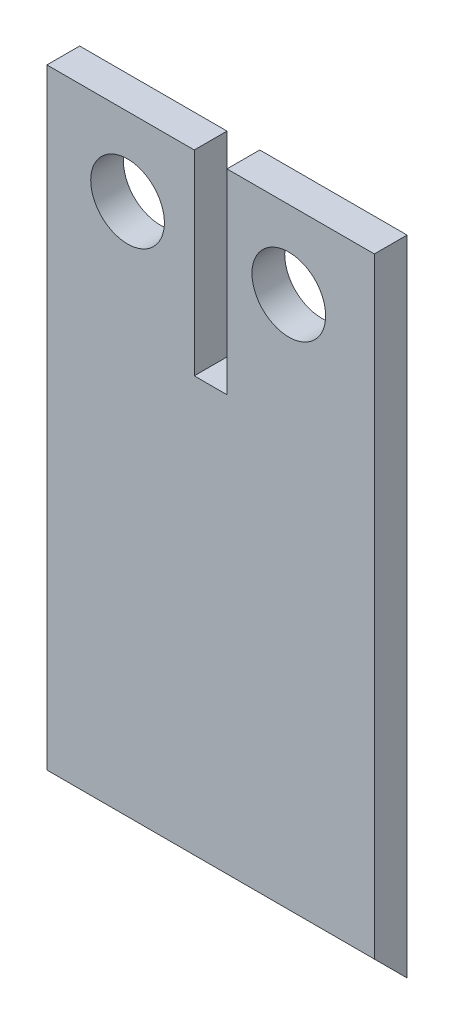
ISO-10303-21;
HEADER;
FILE_DESCRIPTION(('STEP AP214'),'2;1');
FILE_NAME('part.step','',(''),(''),'','','');
FILE_SCHEMA(('AUTOMOTIVE_DESIGN { 1 0 10303 214 1 1 1 1 }'));
ENDSEC;
DATA;
#1=APPLICATION_CONTEXT('core data for automotive mechanical design processes');
#2=APPLICATION_PROTOCOL_DEFINITION('international standard','automotive_design',2000,#1);
#3=PRODUCT_CONTEXT('',#1,'mechanical');
#4=PRODUCT('Part','Part','',(#3));
#5=PRODUCT_RELATED_PRODUCT_CATEGORY('part','',(#4));
#6=PRODUCT_DEFINITION_FORMATION('','',#4);
#7=PRODUCT_DEFINITION_CONTEXT('part definition',#1,'design');
#8=PRODUCT_DEFINITION('design','',#6,#7);
#9=PRODUCT_DEFINITION_SHAPE('','',#8);
#10=(LENGTH_UNIT() NAMED_UNIT(*) SI_UNIT(.MILLI.,.METRE.));
#11=(NAMED_UNIT(*) PLANE_ANGLE_UNIT() SI_UNIT($,.RADIAN.));
#12=(NAMED_UNIT(*) SI_UNIT($,.STERADIAN.) SOLID_ANGLE_UNIT());
#13=UNCERTAINTY_MEASURE_WITH_UNIT(LENGTH_MEASURE(1.E-05),#10,'distance_accuracy_value','');
#14=(GEOMETRIC_REPRESENTATION_CONTEXT(3) GLOBAL_UNCERTAINTY_ASSIGNED_CONTEXT((#13)) GLOBAL_UNIT_ASSIGNED_CONTEXT((#10,
#11,#12)) REPRESENTATION_CONTEXT('',''));
#15=CARTESIAN_POINT('',(0.,0.,0.));
#16=DIRECTION('',(0.,0.,1.));
#17=DIRECTION('',(1.,0.,0.));
#18=AXIS2_PLACEMENT_3D('',#15,#16,#17);
#19=CARTESIAN_POINT('',(-7.72548513664175,14.9609502895532,3.65738581190385));
#20=DIRECTION('',(0.,0.,1.));
#21=DIRECTION('',(1.,0.,0.));
#22=AXIS2_PLACEMENT_3D('',#19,#20,#21);
#23=PLANE('',#22);
#24=DIRECTION('',(0.,1.,0.));
#25=VECTOR('',#24,1.);
#26=CARTESIAN_POINT('',(1.27451486335826,3.01245651019011,3.65738581190385));
#27=LINE('',#26,#25);
#28=CARTESIAN_POINT('',(1.27451486335826,3.01245651019011,3.65738581190385));
#29=VERTEX_POINT('',#28);
#30=CARTESIAN_POINT('',(1.27451486335826,14.9609502895532,3.65738581190385));
#31=VERTEX_POINT('',#30);
#32=EDGE_CURVE('E118',#29,#31,#27,.T.);
#33=ORIENTED_EDGE('',*,*,#32,.T.);
#34=DIRECTION('',(1.,0.,0.));
#35=VECTOR('',#34,1.);
#36=CARTESIAN_POINT('',(-7.72548513664175,14.9609502895532,3.65738581190385));
#37=LINE('',#36,#35);
#38=CARTESIAN_POINT('',(-7.72548513664175,14.9609502895532,3.65738581190385));
#39=VERTEX_POINT('',#38);
#40=EDGE_CURVE('E11',#39,#31,#37,.T.);
#41=ORIENTED_EDGE('',*,*,#40,.F.);
#42=DIRECTION('',(0.,-1.,0.));
#43=VECTOR('',#42,1.);
#44=CARTESIAN_POINT('',(-7.72548513664175,14.9609502895532,3.65738581190385));
#45=LINE('',#44,#43);
#46=CARTESIAN_POINT('',(-7.72548513664175,-22.3407287619297,3.65738581190385));
#47=VERTEX_POINT('',#46);
#48=EDGE_CURVE('E159',#39,#47,#45,.T.);
#49=ORIENTED_EDGE('',*,*,#48,.T.);
#50=DIRECTION('',(1.,0.,0.));
#51=VECTOR('',#50,1.);
#52=CARTESIAN_POINT('',(-7.72548513664175,-22.3407287619297,3.65738581190385));
#53=LINE('',#52,#51);
#54=CARTESIAN_POINT('',(12.2745148633583,-22.3407287619297,3.65738581190385));
#55=VERTEX_POINT('',#54);
#56=EDGE_CURVE('E44',#47,#55,#53,.T.);
#57=ORIENTED_EDGE('',*,*,#56,.T.);
#58=DIRECTION('',(0.,-1.,0.));
#59=VECTOR('',#58,1.);
#60=CARTESIAN_POINT('',(12.2745148633583,14.9609502895532,3.65738581190385));
#61=LINE('',#60,#59);
#62=CARTESIAN_POINT('',(12.2745148633583,14.9609502895532,3.65738581190385));
#63=VERTEX_POINT('',#62);
#64=EDGE_CURVE('E147',#63,#55,#61,.T.);
#65=ORIENTED_EDGE('',*,*,#64,.F.);
#66=CARTESIAN_POINT('',(3.27451486335826,14.9609502895532,3.65738581190385));
#67=VERTEX_POINT('',#66);
#68=EDGE_CURVE('E49',#67,#63,#37,.T.);
#69=ORIENTED_EDGE('',*,*,#68,.F.);
#70=DIRECTION('',(0.,-1.,0.));
#71=VECTOR('',#70,1.);
#72=CARTESIAN_POINT('',(3.27451486335826,14.9609502895532,3.65738581190385));
#73=LINE('',#72,#71);
#74=CARTESIAN_POINT('',(3.27451486335826,3.01245651019011,3.65738581190385));
#75=VERTEX_POINT('',#74);
#76=EDGE_CURVE('E129',#67,#75,#73,.T.);
#77=ORIENTED_EDGE('',*,*,#76,.T.);
#78=DIRECTION('',(-1.,0.,0.));
#79=VECTOR('',#78,1.);
#80=CARTESIAN_POINT('',(3.27451486335826,3.01245651019011,3.65738581190385));
#81=LINE('',#80,#79);
#82=EDGE_CURVE('E124',#75,#29,#81,.T.);
#83=ORIENTED_EDGE('',*,*,#82,.T.);
#84=EDGE_LOOP('',(#33,#41,#49,#57,#65,#69,#77,#83));
#85=FACE_BOUND('',#84,.T.);
#86=CARTESIAN_POINT('',(7.04951486336611,10.1998046715532,3.65738581190385));
#87=DIRECTION('',(0.,0.,-1.));
#88=DIRECTION('',(-1.,0.,0.));
#89=AXIS2_PLACEMENT_3D('',#86,#87,#88);
#90=CIRCLE('',#89,2.24999999996943);
#91=CARTESIAN_POINT('',(4.79951486339668,10.1998046715532,3.65738581190385));
#92=VERTEX_POINT('',#91);
#93=EDGE_CURVE('E286',#92,#92,#90,.T.);
#94=ORIENTED_EDGE('',*,*,#93,.T.);
#95=EDGE_LOOP('',(#94));
#96=FACE_BOUND('',#95,.T.);
#97=CARTESIAN_POINT('',(-2.80048513663389,10.1998046715531,3.65738581190385));
#98=DIRECTION('',(0.,0.,-1.));
#99=DIRECTION('',(-1.,0.,0.));
#100=AXIS2_PLACEMENT_3D('',#97,#98,#99);
#101=CIRCLE('',#100,2.24999999996943);
#102=CARTESIAN_POINT('',(-5.05048513660332,10.1998046715531,3.65738581190385));
#103=VERTEX_POINT('',#102);
#104=EDGE_CURVE('E294',#103,#103,#101,.T.);
#105=ORIENTED_EDGE('',*,*,#104,.T.);
#106=EDGE_LOOP('',(#105));
#107=FACE_BOUND('',#106,.T.);
#108=ADVANCED_FACE('F41',(#85,#96,#107),#23,.T.);
#109=CARTESIAN_POINT('',(-7.72548513664175,14.9609502895532,1.65738581190384));
#110=DIRECTION('',(0.,1.,0.));
#111=DIRECTION('',(0.,0.,1.));
#112=AXIS2_PLACEMENT_3D('',#109,#110,#111);
#113=PLANE('',#112);
#114=DIRECTION('',(0.,0.,-1.));
#115=VECTOR('',#114,1.);
#116=CARTESIAN_POINT('',(1.27451486335826,14.9609502895532,3.65738581190385));
#117=LINE('',#116,#115);
#118=CARTESIAN_POINT('',(1.27451486335826,14.9609502895532,1.65738581190384));
#119=VERTEX_POINT('',#118);
#120=EDGE_CURVE('E116',#31,#119,#117,.T.);
#121=ORIENTED_EDGE('',*,*,#120,.T.);
#122=DIRECTION('',(1.,0.,0.));
#123=VECTOR('',#122,1.);
#124=CARTESIAN_POINT('',(-7.72548513664175,14.9609502895532,1.65738581190384));
#125=LINE('',#124,#123);
#126=CARTESIAN_POINT('',(-7.72548513664175,14.9609502895532,1.65738581190384));
#127=VERTEX_POINT('',#126);
#128=EDGE_CURVE('E136',#127,#119,#125,.T.);
#129=ORIENTED_EDGE('',*,*,#128,.F.);
#130=DIRECTION('',(0.,0.,1.));
#131=VECTOR('',#130,1.);
#132=CARTESIAN_POINT('',(-7.72548513664175,14.9609502895532,1.65738581190384));
#133=LINE('',#132,#131);
#134=EDGE_CURVE('E135',#127,#39,#133,.T.);
#135=ORIENTED_EDGE('',*,*,#134,.T.);
#136=ORIENTED_EDGE('',*,*,#40,.T.);
#137=EDGE_LOOP('',(#121,#129,#135,#136));
#138=FACE_BOUND('',#137,.T.);
#139=ADVANCED_FACE('F133',(#138),#113,.T.);
#140=DIRECTION('',(0.,0.,-1.));
#141=VECTOR('',#140,1.);
#142=CARTESIAN_POINT('',(3.27451486335826,14.9609502895532,3.65738581190385));
#143=LINE('',#142,#141);
#144=CARTESIAN_POINT('',(3.27451486335826,14.9609502895532,1.65738581190384));
#145=VERTEX_POINT('',#144);
#146=EDGE_CURVE('E57',#67,#145,#143,.T.);
#147=ORIENTED_EDGE('',*,*,#146,.F.);
#148=ORIENTED_EDGE('',*,*,#68,.T.);
#149=DIRECTION('',(0.,0.,1.));
#150=VECTOR('',#149,1.);
#151=CARTESIAN_POINT('',(12.2745148633583,14.9609502895532,1.65738581190384));
#152=LINE('',#151,#150);
#153=CARTESIAN_POINT('',(12.2745148633583,14.9609502895532,1.65738581190384));
#154=VERTEX_POINT('',#153);
#155=EDGE_CURVE('E157',#154,#63,#152,.T.);
#156=ORIENTED_EDGE('',*,*,#155,.F.);
#157=EDGE_CURVE('E161',#145,#154,#125,.T.);
#158=ORIENTED_EDGE('',*,*,#157,.F.);
#159=EDGE_LOOP('',(#147,#148,#156,#158));
#160=FACE_BOUND('',#159,.T.);
#161=ADVANCED_FACE('F170',(#160),#113,.T.);
#162=CARTESIAN_POINT('',(-7.72548513664175,-24.3407287619297,1.65738581190384));
#163=DIRECTION('',(0.,0.,-1.));
#164=DIRECTION('',(-1.,0.,0.));
#165=AXIS2_PLACEMENT_3D('',#162,#163,#164);
#166=PLANE('',#165);
#167=CARTESIAN_POINT('',(-2.80048513663389,10.1998046715531,1.65738581190384));
#168=DIRECTION('',(0.,0.,-1.));
#169=DIRECTION('',(-1.,0.,0.));
#170=AXIS2_PLACEMENT_3D('',#167,#168,#169);
#171=CIRCLE('',#170,2.24999999996943);
#172=CARTESIAN_POINT('',(-5.05048513660332,10.1998046715531,1.65738581190384));
#173=VERTEX_POINT('',#172);
#174=EDGE_CURVE('E297',#173,#173,#171,.T.);
#175=ORIENTED_EDGE('',*,*,#174,.F.);
#176=EDGE_LOOP('',(#175));
#177=FACE_BOUND('',#176,.T.);
#178=CARTESIAN_POINT('',(7.04951486336611,10.1998046715532,1.65738581190384));
#179=DIRECTION('',(0.,0.,-1.));
#180=DIRECTION('',(-1.,0.,0.));
#181=AXIS2_PLACEMENT_3D('',#178,#179,#180);
#182=CIRCLE('',#181,2.24999999996943);
#183=CARTESIAN_POINT('',(4.79951486339668,10.1998046715532,1.65738581190384));
#184=VERTEX_POINT('',#183);
#185=EDGE_CURVE('E291',#184,#184,#182,.T.);
#186=ORIENTED_EDGE('',*,*,#185,.F.);
#187=EDGE_LOOP('',(#186));
#188=FACE_BOUND('',#187,.T.);
#189=DIRECTION('',(0.,1.,0.));
#190=VECTOR('',#189,1.);
#191=CARTESIAN_POINT('',(1.27451486335826,3.01245651019011,1.65738581190384));
#192=LINE('',#191,#190);
#193=CARTESIAN_POINT('',(1.27451486335826,3.01245651019011,1.65738581190384));
#194=VERTEX_POINT('',#193);
#195=EDGE_CURVE('E121',#194,#119,#192,.T.);
#196=ORIENTED_EDGE('',*,*,#195,.F.);
#197=DIRECTION('',(-1.,0.,0.));
#198=VECTOR('',#197,1.);
#199=CARTESIAN_POINT('',(3.27451486335826,3.01245651019011,1.65738581190384));
#200=LINE('',#199,#198);
#201=CARTESIAN_POINT('',(3.27451486335826,3.01245651019011,1.65738581190384));
#202=VERTEX_POINT('',#201);
#203=EDGE_CURVE('E130',#202,#194,#200,.T.);
#204=ORIENTED_EDGE('',*,*,#203,.F.);
#205=DIRECTION('',(0.,-1.,0.));
#206=VECTOR('',#205,1.);
#207=CARTESIAN_POINT('',(3.27451486335826,14.9609502895532,1.65738581190384));
#208=LINE('',#207,#206);
#209=EDGE_CURVE('E167',#145,#202,#208,.T.);
#210=ORIENTED_EDGE('',*,*,#209,.F.);
#211=ORIENTED_EDGE('',*,*,#157,.T.);
#212=DIRECTION('',(0.,1.,0.));
#213=VECTOR('',#212,1.);
#214=CARTESIAN_POINT('',(12.2745148633583,-24.3407287619297,1.65738581190384));
#215=LINE('',#214,#213);
#216=CARTESIAN_POINT('',(12.2745148633583,-24.3407287619297,1.65738581190384));
#217=VERTEX_POINT('',#216);
#218=EDGE_CURVE('E154',#217,#154,#215,.T.);
#219=ORIENTED_EDGE('',*,*,#218,.F.);
#220=DIRECTION('',(1.,0.,0.));
#221=VECTOR('',#220,1.);
#222=CARTESIAN_POINT('',(-7.72548513664175,-24.3407287619297,1.65738581190384));
#223=LINE('',#222,#221);
#224=CARTESIAN_POINT('',(-7.72548513664175,-24.3407287619297,1.65738581190384));
#225=VERTEX_POINT('',#224);
#226=EDGE_CURVE('E142',#225,#217,#223,.T.);
#227=ORIENTED_EDGE('',*,*,#226,.F.);
#228=DIRECTION('',(0.,1.,0.));
#229=VECTOR('',#228,1.);
#230=CARTESIAN_POINT('',(-7.72548513664175,-24.3407287619297,1.65738581190384));
#231=LINE('',#230,#229);
#232=EDGE_CURVE('E140',#225,#127,#231,.T.);
#233=ORIENTED_EDGE('',*,*,#232,.T.);
#234=ORIENTED_EDGE('',*,*,#128,.T.);
#235=EDGE_LOOP('',(#196,#204,#210,#211,#219,#227,#233,#234));
#236=FACE_BOUND('',#235,.T.);
#237=ADVANCED_FACE('F165',(#177,#188,#236),#166,.T.);
#238=CARTESIAN_POINT('',(-7.72548513664175,-22.3407287619297,3.65738581190385));
#239=DIRECTION('',(0.,-0.707106781186547,0.707106781186548));
#240=DIRECTION('',(0.,-0.707106781186548,-0.707106781186547));
#241=AXIS2_PLACEMENT_3D('',#238,#239,#240);
#242=PLANE('',#241);
#243=DIRECTION('',(0.,-0.707106781186548,-0.707106781186547));
#244=VECTOR('',#243,1.);
#245=CARTESIAN_POINT('',(12.2745148633583,-22.3407287619297,3.65738581190385));
#246=LINE('',#245,#244);
#247=EDGE_CURVE('E150',#55,#217,#246,.T.);
#248=ORIENTED_EDGE('',*,*,#247,.F.);
#249=ORIENTED_EDGE('',*,*,#56,.F.);
#250=DIRECTION('',(0.,-0.707106781186548,-0.707106781186547));
#251=VECTOR('',#250,1.);
#252=CARTESIAN_POINT('',(-7.72548513664175,-22.3407287619297,3.65738581190385));
#253=LINE('',#252,#251);
#254=EDGE_CURVE('E143',#47,#225,#253,.T.);
#255=ORIENTED_EDGE('',*,*,#254,.T.);
#256=ORIENTED_EDGE('',*,*,#226,.T.);
#257=EDGE_LOOP('',(#248,#249,#255,#256));
#258=FACE_BOUND('',#257,.T.);
#259=ADVANCED_FACE('F178',(#258),#242,.T.);
#260=CARTESIAN_POINT('',(-7.72548513664175,0.,0.));
#261=DIRECTION('',(-1.,0.,0.));
#262=DIRECTION('',(0.,0.,1.));
#263=AXIS2_PLACEMENT_3D('',#260,#261,#262);
#264=PLANE('',#263);
#265=ORIENTED_EDGE('',*,*,#48,.F.);
#266=ORIENTED_EDGE('',*,*,#134,.F.);
#267=ORIENTED_EDGE('',*,*,#232,.F.);
#268=ORIENTED_EDGE('',*,*,#254,.F.);
#269=EDGE_LOOP('',(#265,#266,#267,#268));
#270=FACE_BOUND('',#269,.T.);
#271=ADVANCED_FACE('F227',(#270),#264,.T.);
#272=CARTESIAN_POINT('',(12.2745148633583,0.,0.));
#273=DIRECTION('',(-1.,0.,0.));
#274=DIRECTION('',(0.,0.,1.));
#275=AXIS2_PLACEMENT_3D('',#272,#273,#274);
#276=PLANE('',#275);
#277=ORIENTED_EDGE('',*,*,#64,.T.);
#278=ORIENTED_EDGE('',*,*,#247,.T.);
#279=ORIENTED_EDGE('',*,*,#218,.T.);
#280=ORIENTED_EDGE('',*,*,#155,.T.);
#281=EDGE_LOOP('',(#277,#278,#279,#280));
#282=FACE_BOUND('',#281,.T.);
#283=ADVANCED_FACE('F169',(#282),#276,.F.);
#284=CARTESIAN_POINT('',(1.27451486335826,3.01245651019011,3.65738581190385));
#285=DIRECTION('',(-1.,0.,0.));
#286=DIRECTION('',(0.,0.,1.));
#287=AXIS2_PLACEMENT_3D('',#284,#285,#286);
#288=PLANE('',#287);
#289=ORIENTED_EDGE('',*,*,#195,.T.);
#290=ORIENTED_EDGE('',*,*,#120,.F.);
#291=ORIENTED_EDGE('',*,*,#32,.F.);
#292=DIRECTION('',(0.,0.,-1.));
#293=VECTOR('',#292,1.);
#294=CARTESIAN_POINT('',(1.27451486335826,3.01245651019011,3.65738581190385));
#295=LINE('',#294,#293);
#296=EDGE_CURVE('E151',#29,#194,#295,.T.);
#297=ORIENTED_EDGE('',*,*,#296,.T.);
#298=EDGE_LOOP('',(#289,#290,#291,#297));
#299=FACE_BOUND('',#298,.T.);
#300=ADVANCED_FACE('F117',(#299),#288,.F.);
#301=CARTESIAN_POINT('',(3.27451486335826,3.01245651019011,3.65738581190385));
#302=DIRECTION('',(0.,-1.,0.));
#303=DIRECTION('',(0.,0.,-1.));
#304=AXIS2_PLACEMENT_3D('',#301,#302,#303);
#305=PLANE('',#304);
#306=ORIENTED_EDGE('',*,*,#203,.T.);
#307=ORIENTED_EDGE('',*,*,#296,.F.);
#308=ORIENTED_EDGE('',*,*,#82,.F.);
#309=DIRECTION('',(0.,0.,-1.));
#310=VECTOR('',#309,1.);
#311=CARTESIAN_POINT('',(3.27451486335826,3.01245651019011,3.65738581190385));
#312=LINE('',#311,#310);
#313=EDGE_CURVE('E279',#75,#202,#312,.T.);
#314=ORIENTED_EDGE('',*,*,#313,.T.);
#315=EDGE_LOOP('',(#306,#307,#308,#314));
#316=FACE_BOUND('',#315,.T.);
#317=ADVANCED_FACE('F222',(#316),#305,.F.);
#318=CARTESIAN_POINT('',(3.27451486335826,14.9609502895532,3.65738581190385));
#319=DIRECTION('',(1.,0.,0.));
#320=DIRECTION('',(0.,0.,-1.));
#321=AXIS2_PLACEMENT_3D('',#318,#319,#320);
#322=PLANE('',#321);
#323=ORIENTED_EDGE('',*,*,#209,.T.);
#324=ORIENTED_EDGE('',*,*,#313,.F.);
#325=ORIENTED_EDGE('',*,*,#76,.F.);
#326=ORIENTED_EDGE('',*,*,#146,.T.);
#327=EDGE_LOOP('',(#323,#324,#325,#326));
#328=FACE_BOUND('',#327,.T.);
#329=ADVANCED_FACE('F190',(#328),#322,.F.);
#330=CARTESIAN_POINT('',(7.04951486336611,10.1998046715532,1.65738581190384));
#331=DIRECTION('',(0.,0.,-1.));
#332=DIRECTION('',(-1.,0.,0.));
#333=AXIS2_PLACEMENT_3D('',#330,#331,#332);
#334=CYLINDRICAL_SURFACE('',#333,2.24999999996943);
#335=ORIENTED_EDGE('',*,*,#93,.F.);
#336=EDGE_LOOP('',(#335));
#337=FACE_BOUND('',#336,.T.);
#338=ORIENTED_EDGE('',*,*,#185,.T.);
#339=EDGE_LOOP('',(#338));
#340=FACE_BOUND('',#339,.T.);
#341=ADVANCED_FACE('F201',(#337,#340),#334,.F.);
#342=CARTESIAN_POINT('',(-2.80048513663389,10.1998046715531,1.65738581190384));
#343=DIRECTION('',(0.,0.,-1.));
#344=DIRECTION('',(-1.,0.,0.));
#345=AXIS2_PLACEMENT_3D('',#342,#343,#344);
#346=CYLINDRICAL_SURFACE('',#345,2.24999999996943);
#347=ORIENTED_EDGE('',*,*,#104,.F.);
#348=EDGE_LOOP('',(#347));
#349=FACE_BOUND('',#348,.T.);
#350=ORIENTED_EDGE('',*,*,#174,.T.);
#351=EDGE_LOOP('',(#350));
#352=FACE_BOUND('',#351,.T.);
#353=ADVANCED_FACE('F205',(#349,#352),#346,.F.);
#354=CLOSED_SHELL('',(#108,#139,#161,#237,#259,#271,#283,#300,#317,#329,#341,#353));
#355=MANIFOLD_SOLID_BREP('B2',#354);
#356=ADVANCED_BREP_SHAPE_REPRESENTATION('',(#18,#355),#14);
#357=SHAPE_DEFINITION_REPRESENTATION(#9,#356);
ENDSEC;
END-ISO-10303-21;
